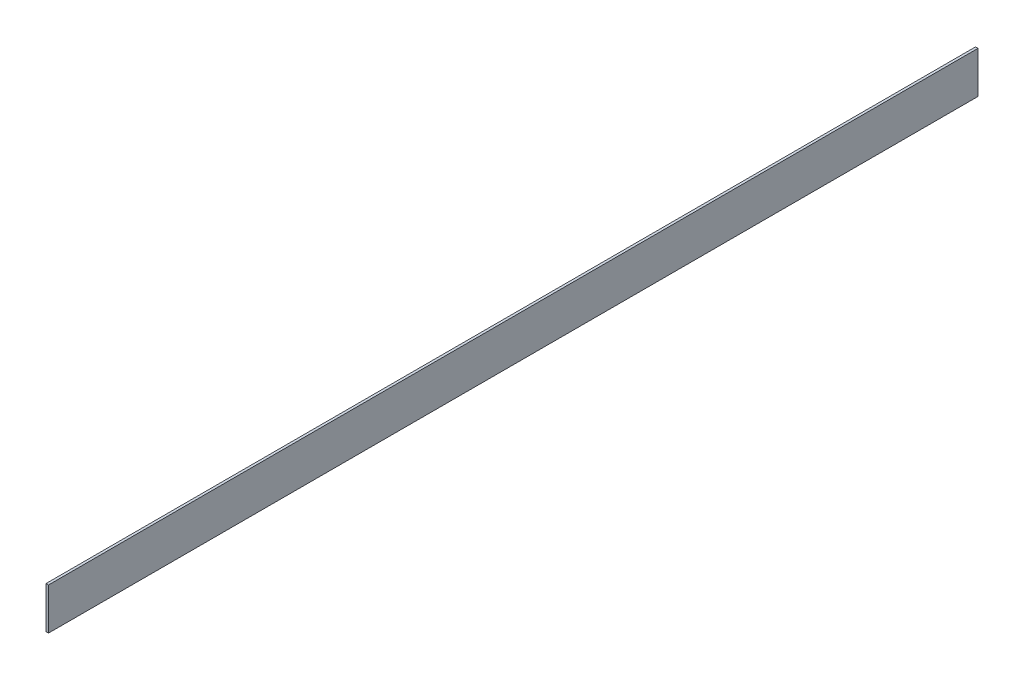
ISO-10303-21;
HEADER;
FILE_DESCRIPTION(('STEP AP214'),'2;1');
FILE_NAME('part.step','',(''),(''),'','','');
FILE_SCHEMA(('AUTOMOTIVE_DESIGN { 1 0 10303 214 1 1 1 1 }'));
ENDSEC;
DATA;
#1=APPLICATION_CONTEXT('core data for automotive mechanical design processes');
#2=APPLICATION_PROTOCOL_DEFINITION('international standard','automotive_design',2000,#1);
#3=PRODUCT_CONTEXT('',#1,'mechanical');
#4=PRODUCT('Part','Part','',(#3));
#5=PRODUCT_RELATED_PRODUCT_CATEGORY('part','',(#4));
#6=PRODUCT_DEFINITION_FORMATION('','',#4);
#7=PRODUCT_DEFINITION_CONTEXT('part definition',#1,'design');
#8=PRODUCT_DEFINITION('design','',#6,#7);
#9=PRODUCT_DEFINITION_SHAPE('','',#8);
#10=(LENGTH_UNIT() NAMED_UNIT(*) SI_UNIT(.MILLI.,.METRE.));
#11=(NAMED_UNIT(*) PLANE_ANGLE_UNIT() SI_UNIT($,.RADIAN.));
#12=(NAMED_UNIT(*) SI_UNIT($,.STERADIAN.) SOLID_ANGLE_UNIT());
#13=UNCERTAINTY_MEASURE_WITH_UNIT(LENGTH_MEASURE(1.E-05),#10,'distance_accuracy_value','');
#14=(GEOMETRIC_REPRESENTATION_CONTEXT(3) GLOBAL_UNCERTAINTY_ASSIGNED_CONTEXT((#13)) GLOBAL_UNIT_ASSIGNED_CONTEXT((#10,
#11,#12)) REPRESENTATION_CONTEXT('',''));
#15=CARTESIAN_POINT('',(0.,0.,0.));
#16=DIRECTION('',(0.,0.,1.));
#17=DIRECTION('',(1.,0.,0.));
#18=AXIS2_PLACEMENT_3D('',#15,#16,#17);
#19=CARTESIAN_POINT('',(0.,0.,1188.466));
#20=DIRECTION('',(1.,0.,0.));
#21=DIRECTION('',(0.,0.,-1.));
#22=AXIS2_PLACEMENT_3D('',#19,#20,#21);
#23=PLANE('',#22);
#24=DIRECTION('',(0.,-1.,0.));
#25=VECTOR('',#24,1.);
#26=CARTESIAN_POINT('',(0.,0.,0.));
#27=LINE('',#26,#25);
#28=CARTESIAN_POINT('',(0.,53.34,0.));
#29=VERTEX_POINT('',#28);
#30=CARTESIAN_POINT('',(0.,0.,0.));
#31=VERTEX_POINT('',#30);
#32=EDGE_CURVE('E105',#29,#31,#27,.T.);
#33=ORIENTED_EDGE('',*,*,#32,.T.);
#34=DIRECTION('',(0.,0.,-1.));
#35=VECTOR('',#34,1.);
#36=CARTESIAN_POINT('',(0.,0.,1188.466));
#37=LINE('',#36,#35);
#38=CARTESIAN_POINT('',(0.,0.,1188.466));
#39=VERTEX_POINT('',#38);
#40=EDGE_CURVE('E11',#39,#31,#37,.T.);
#41=ORIENTED_EDGE('',*,*,#40,.F.);
#42=DIRECTION('',(0.,-1.,0.));
#43=VECTOR('',#42,1.);
#44=CARTESIAN_POINT('',(0.,0.,1188.466));
#45=LINE('',#44,#43);
#46=CARTESIAN_POINT('',(0.,53.34,1188.466));
#47=VERTEX_POINT('',#46);
#48=EDGE_CURVE('E93',#47,#39,#45,.T.);
#49=ORIENTED_EDGE('',*,*,#48,.F.);
#50=DIRECTION('',(0.,0.,-1.));
#51=VECTOR('',#50,1.);
#52=CARTESIAN_POINT('',(0.,53.34,1188.466));
#53=LINE('',#52,#51);
#54=EDGE_CURVE('E101',#47,#29,#53,.T.);
#55=ORIENTED_EDGE('',*,*,#54,.T.);
#56=EDGE_LOOP('',(#33,#41,#49,#55));
#57=FACE_BOUND('',#56,.T.);
#58=ADVANCED_FACE('F42',(#57),#23,.F.);
#59=CARTESIAN_POINT('',(0.,0.,1188.466));
#60=DIRECTION('',(0.,1.,0.));
#61=DIRECTION('',(0.,0.,1.));
#62=AXIS2_PLACEMENT_3D('',#59,#60,#61);
#63=PLANE('',#62);
#64=DIRECTION('',(1.,0.,0.));
#65=VECTOR('',#64,1.);
#66=CARTESIAN_POINT('',(0.,0.,0.));
#67=LINE('',#66,#65);
#68=CARTESIAN_POINT('',(3.175,0.,0.));
#69=VERTEX_POINT('',#68);
#70=EDGE_CURVE('E97',#31,#69,#67,.T.);
#71=ORIENTED_EDGE('',*,*,#70,.T.);
#72=DIRECTION('',(0.,0.,-1.));
#73=VECTOR('',#72,1.);
#74=CARTESIAN_POINT('',(3.175,0.,1188.466));
#75=LINE('',#74,#73);
#76=CARTESIAN_POINT('',(3.175,0.,1188.466));
#77=VERTEX_POINT('',#76);
#78=EDGE_CURVE('E50',#77,#69,#75,.T.);
#79=ORIENTED_EDGE('',*,*,#78,.F.);
#80=DIRECTION('',(1.,0.,0.));
#81=VECTOR('',#80,1.);
#82=CARTESIAN_POINT('',(0.,0.,1188.466));
#83=LINE('',#82,#81);
#84=EDGE_CURVE('E88',#39,#77,#83,.T.);
#85=ORIENTED_EDGE('',*,*,#84,.F.);
#86=ORIENTED_EDGE('',*,*,#40,.T.);
#87=EDGE_LOOP('',(#71,#79,#85,#86));
#88=FACE_BOUND('',#87,.T.);
#89=ADVANCED_FACE('F96',(#88),#63,.F.);
#90=CARTESIAN_POINT('',(3.175,0.,1188.466));
#91=DIRECTION('',(-1.,0.,0.));
#92=DIRECTION('',(0.,0.,1.));
#93=AXIS2_PLACEMENT_3D('',#90,#91,#92);
#94=PLANE('',#93);
#95=DIRECTION('',(0.,1.,0.));
#96=VECTOR('',#95,1.);
#97=CARTESIAN_POINT('',(3.175,0.,0.));
#98=LINE('',#97,#96);
#99=CARTESIAN_POINT('',(3.175,53.34,0.));
#100=VERTEX_POINT('',#99);
#101=EDGE_CURVE('E75',#69,#100,#98,.T.);
#102=ORIENTED_EDGE('',*,*,#101,.T.);
#103=DIRECTION('',(0.,0.,-1.));
#104=VECTOR('',#103,1.);
#105=CARTESIAN_POINT('',(3.175,53.34,1188.466));
#106=LINE('',#105,#104);
#107=CARTESIAN_POINT('',(3.175,53.34,1188.466));
#108=VERTEX_POINT('',#107);
#109=EDGE_CURVE('E98',#108,#100,#106,.T.);
#110=ORIENTED_EDGE('',*,*,#109,.F.);
#111=DIRECTION('',(0.,1.,0.));
#112=VECTOR('',#111,1.);
#113=CARTESIAN_POINT('',(3.175,0.,1188.466));
#114=LINE('',#113,#112);
#115=EDGE_CURVE('E91',#77,#108,#114,.T.);
#116=ORIENTED_EDGE('',*,*,#115,.F.);
#117=ORIENTED_EDGE('',*,*,#78,.T.);
#118=EDGE_LOOP('',(#102,#110,#116,#117));
#119=FACE_BOUND('',#118,.T.);
#120=ADVANCED_FACE('F99',(#119),#94,.F.);
#121=CARTESIAN_POINT('',(0.,53.34,1188.466));
#122=DIRECTION('',(0.,-1.,0.));
#123=DIRECTION('',(0.,0.,-1.));
#124=AXIS2_PLACEMENT_3D('',#121,#122,#123);
#125=PLANE('',#124);
#126=DIRECTION('',(-1.,0.,0.));
#127=VECTOR('',#126,1.);
#128=CARTESIAN_POINT('',(0.,53.34,0.));
#129=LINE('',#128,#127);
#130=EDGE_CURVE('E81',#100,#29,#129,.T.);
#131=ORIENTED_EDGE('',*,*,#130,.T.);
#132=ORIENTED_EDGE('',*,*,#54,.F.);
#133=DIRECTION('',(-1.,0.,0.));
#134=VECTOR('',#133,1.);
#135=CARTESIAN_POINT('',(0.,53.34,1188.466));
#136=LINE('',#135,#134);
#137=EDGE_CURVE('E58',#108,#47,#136,.T.);
#138=ORIENTED_EDGE('',*,*,#137,.F.);
#139=ORIENTED_EDGE('',*,*,#109,.T.);
#140=EDGE_LOOP('',(#131,#132,#138,#139));
#141=FACE_BOUND('',#140,.T.);
#142=ADVANCED_FACE('F112',(#141),#125,.F.);
#143=CARTESIAN_POINT('',(0.,0.,1188.466));
#144=DIRECTION('',(0.,0.,-1.));
#145=DIRECTION('',(-1.,0.,0.));
#146=AXIS2_PLACEMENT_3D('',#143,#144,#145);
#147=PLANE('',#146);
#148=ORIENTED_EDGE('',*,*,#48,.T.);
#149=ORIENTED_EDGE('',*,*,#84,.T.);
#150=ORIENTED_EDGE('',*,*,#115,.T.);
#151=ORIENTED_EDGE('',*,*,#137,.T.);
#152=EDGE_LOOP('',(#148,#149,#150,#151));
#153=FACE_BOUND('',#152,.T.);
#154=ADVANCED_FACE('F89',(#153),#147,.F.);
#155=CARTESIAN_POINT('',(0.,0.,0.));
#156=DIRECTION('',(0.,0.,-1.));
#157=DIRECTION('',(-1.,0.,0.));
#158=AXIS2_PLACEMENT_3D('',#155,#156,#157);
#159=PLANE('',#158);
#160=ORIENTED_EDGE('',*,*,#32,.F.);
#161=ORIENTED_EDGE('',*,*,#130,.F.);
#162=ORIENTED_EDGE('',*,*,#101,.F.);
#163=ORIENTED_EDGE('',*,*,#70,.F.);
#164=EDGE_LOOP('',(#160,#161,#162,#163));
#165=FACE_BOUND('',#164,.T.);
#166=ADVANCED_FACE('F115',(#165),#159,.T.);
#167=CLOSED_SHELL('',(#58,#89,#120,#142,#154,#166));
#168=MANIFOLD_SOLID_BREP('B2',#167);
#169=ADVANCED_BREP_SHAPE_REPRESENTATION('',(#18,#168),#14);
#170=SHAPE_DEFINITION_REPRESENTATION(#9,#169);
ENDSEC;
END-ISO-10303-21;
